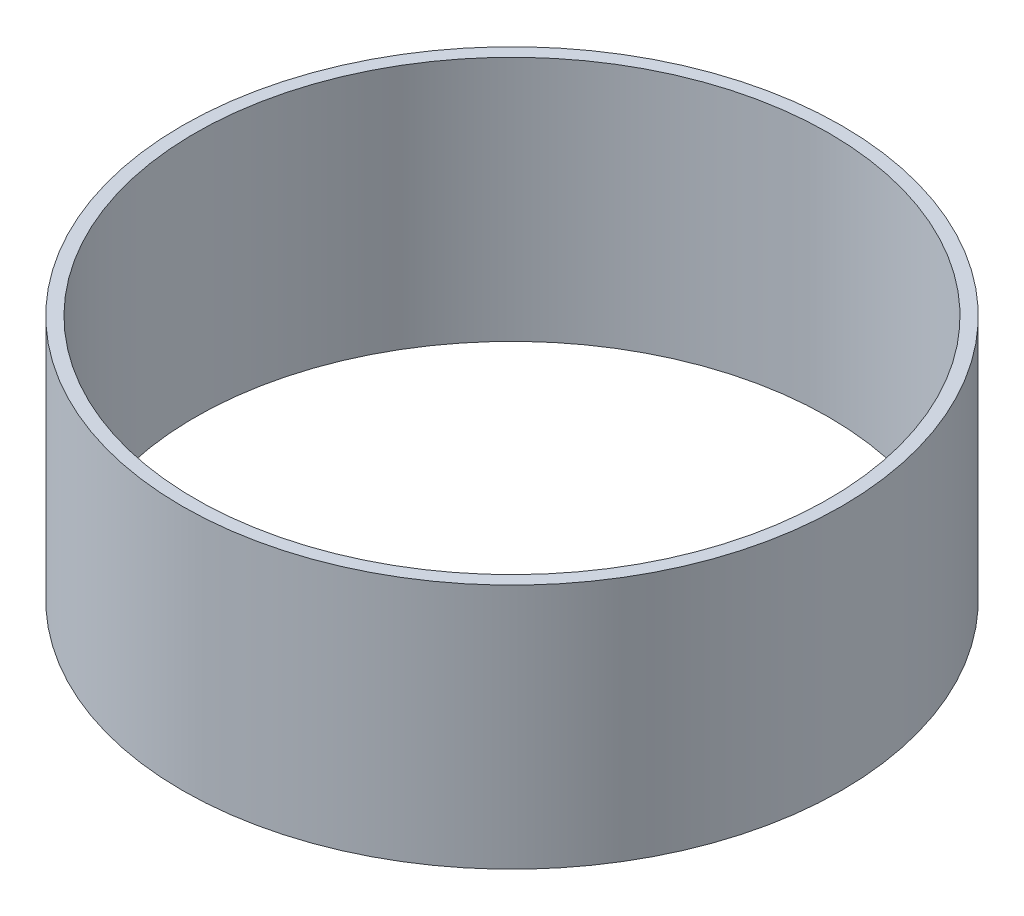
ISO-10303-21;
HEADER;
FILE_DESCRIPTION(('STEP AP214'),'2;1');
FILE_NAME('part.step','',(''),(''),'','','');
FILE_SCHEMA(('AUTOMOTIVE_DESIGN { 1 0 10303 214 1 1 1 1 }'));
ENDSEC;
DATA;
#1=APPLICATION_CONTEXT('core data for automotive mechanical design processes');
#2=APPLICATION_PROTOCOL_DEFINITION('international standard','automotive_design',2000,#1);
#3=PRODUCT_CONTEXT('',#1,'mechanical');
#4=PRODUCT('Part','Part','',(#3));
#5=PRODUCT_RELATED_PRODUCT_CATEGORY('part','',(#4));
#6=PRODUCT_DEFINITION_FORMATION('','',#4);
#7=PRODUCT_DEFINITION_CONTEXT('part definition',#1,'design');
#8=PRODUCT_DEFINITION('design','',#6,#7);
#9=PRODUCT_DEFINITION_SHAPE('','',#8);
#10=(LENGTH_UNIT() NAMED_UNIT(*) SI_UNIT(.MILLI.,.METRE.));
#11=(NAMED_UNIT(*) PLANE_ANGLE_UNIT() SI_UNIT($,.RADIAN.));
#12=(NAMED_UNIT(*) SI_UNIT($,.STERADIAN.) SOLID_ANGLE_UNIT());
#13=UNCERTAINTY_MEASURE_WITH_UNIT(LENGTH_MEASURE(1.E-05),#10,'distance_accuracy_value','');
#14=(GEOMETRIC_REPRESENTATION_CONTEXT(3) GLOBAL_UNCERTAINTY_ASSIGNED_CONTEXT((#13)) GLOBAL_UNIT_ASSIGNED_CONTEXT((#10,
#11,#12)) REPRESENTATION_CONTEXT('',''));
#15=CARTESIAN_POINT('',(0.,0.,0.));
#16=DIRECTION('',(0.,0.,1.));
#17=DIRECTION('',(1.,0.,0.));
#18=AXIS2_PLACEMENT_3D('',#15,#16,#17);
#19=CARTESIAN_POINT('',(0.,38.1,0.));
#20=DIRECTION('',(0.,1.,0.));
#21=DIRECTION('',(0.,0.,1.));
#22=AXIS2_PLACEMENT_3D('',#19,#20,#21);
#23=PLANE('',#22);
#24=CARTESIAN_POINT('',(0.,38.1,0.));
#25=DIRECTION('',(0.,1.,0.));
#26=DIRECTION('',(0.,0.,1.));
#27=AXIS2_PLACEMENT_3D('',#24,#25,#26);
#28=CIRCLE('',#27,51.054);
#29=CARTESIAN_POINT('',(0.,38.1,-51.054));
#30=VERTEX_POINT('',#29);
#31=EDGE_CURVE('E10',#30,#30,#28,.T.);
#32=ORIENTED_EDGE('',*,*,#31,.T.);
#33=EDGE_LOOP('',(#32));
#34=FACE_BOUND('',#33,.T.);
#35=CARTESIAN_POINT('',(0.,38.1,0.));
#36=DIRECTION('',(0.,1.,0.));
#37=DIRECTION('',(0.,0.,1.));
#38=AXIS2_PLACEMENT_3D('',#35,#36,#37);
#39=CIRCLE('',#38,49.0601);
#40=CARTESIAN_POINT('',(0.,38.1,-49.0601));
#41=VERTEX_POINT('',#40);
#42=EDGE_CURVE('E56',#41,#41,#39,.T.);
#43=ORIENTED_EDGE('',*,*,#42,.F.);
#44=EDGE_LOOP('',(#43));
#45=FACE_BOUND('',#44,.T.);
#46=ADVANCED_FACE('F43',(#34,#45),#23,.T.);
#47=CARTESIAN_POINT('',(0.,0.,0.));
#48=DIRECTION('',(0.,1.,0.));
#49=DIRECTION('',(0.,0.,1.));
#50=AXIS2_PLACEMENT_3D('',#47,#48,#49);
#51=PLANE('',#50);
#52=CARTESIAN_POINT('',(0.,0.,0.));
#53=DIRECTION('',(0.,1.,0.));
#54=DIRECTION('',(0.,0.,1.));
#55=AXIS2_PLACEMENT_3D('',#52,#53,#54);
#56=CIRCLE('',#55,51.054);
#57=CARTESIAN_POINT('',(0.,0.,-51.054));
#58=VERTEX_POINT('',#57);
#59=EDGE_CURVE('E47',#58,#58,#56,.T.);
#60=ORIENTED_EDGE('',*,*,#59,.F.);
#61=EDGE_LOOP('',(#60));
#62=FACE_BOUND('',#61,.T.);
#63=CARTESIAN_POINT('',(0.,0.,0.));
#64=DIRECTION('',(0.,1.,0.));
#65=DIRECTION('',(0.,0.,1.));
#66=AXIS2_PLACEMENT_3D('',#63,#64,#65);
#67=CIRCLE('',#66,49.0601);
#68=CARTESIAN_POINT('',(0.,0.,-49.0601));
#69=VERTEX_POINT('',#68);
#70=EDGE_CURVE('E58',#69,#69,#67,.T.);
#71=ORIENTED_EDGE('',*,*,#70,.T.);
#72=EDGE_LOOP('',(#71));
#73=FACE_BOUND('',#72,.T.);
#74=ADVANCED_FACE('F70',(#62,#73),#51,.F.);
#75=CARTESIAN_POINT('',(0.,38.1,0.));
#76=DIRECTION('',(0.,-1.,0.));
#77=DIRECTION('',(0.,0.,-1.));
#78=AXIS2_PLACEMENT_3D('',#75,#76,#77);
#79=CYLINDRICAL_SURFACE('',#78,51.054);
#80=CARTESIAN_POINT('',(0.,38.1,-51.054));
#81=CARTESIAN_POINT('',(0.,37.703125,-51.054));
#82=CARTESIAN_POINT('',(0.,37.30625,-51.054));
#83=CARTESIAN_POINT('',(0.,36.5125,-51.054));
#84=CARTESIAN_POINT('',(0.,36.115625,-51.054));
#85=CARTESIAN_POINT('',(0.,35.321875,-51.054));
#86=CARTESIAN_POINT('',(0.,34.925,-51.054));
#87=CARTESIAN_POINT('',(0.,34.13125,-51.054));
#88=CARTESIAN_POINT('',(0.,33.734375,-51.054));
#89=CARTESIAN_POINT('',(0.,32.940625,-51.054));
#90=CARTESIAN_POINT('',(0.,32.54375,-51.054));
#91=CARTESIAN_POINT('',(0.,31.75,-51.054));
#92=CARTESIAN_POINT('',(0.,31.353125,-51.054));
#93=CARTESIAN_POINT('',(0.,30.559375,-51.054));
#94=CARTESIAN_POINT('',(0.,30.1625,-51.054));
#95=CARTESIAN_POINT('',(0.,29.36875,-51.054));
#96=CARTESIAN_POINT('',(0.,28.971875,-51.054));
#97=CARTESIAN_POINT('',(0.,28.178125,-51.054));
#98=CARTESIAN_POINT('',(0.,27.78125,-51.054));
#99=CARTESIAN_POINT('',(0.,26.9875,-51.054));
#100=CARTESIAN_POINT('',(0.,26.590625,-51.054));
#101=CARTESIAN_POINT('',(0.,25.796875,-51.054));
#102=CARTESIAN_POINT('',(0.,25.4,-51.054));
#103=CARTESIAN_POINT('',(0.,24.60625,-51.054));
#104=CARTESIAN_POINT('',(0.,24.209375,-51.054));
#105=CARTESIAN_POINT('',(0.,23.415625,-51.054));
#106=CARTESIAN_POINT('',(0.,23.01875,-51.054));
#107=CARTESIAN_POINT('',(0.,22.225,-51.054));
#108=CARTESIAN_POINT('',(0.,21.828125,-51.054));
#109=CARTESIAN_POINT('',(0.,21.034375,-51.054));
#110=CARTESIAN_POINT('',(0.,20.6375,-51.054));
#111=CARTESIAN_POINT('',(0.,19.84375,-51.054));
#112=CARTESIAN_POINT('',(0.,19.446875,-51.054));
#113=CARTESIAN_POINT('',(0.,18.653125,-51.054));
#114=CARTESIAN_POINT('',(0.,18.25625,-51.054));
#115=CARTESIAN_POINT('',(0.,17.4625,-51.054));
#116=CARTESIAN_POINT('',(0.,17.065625,-51.054));
#117=CARTESIAN_POINT('',(0.,16.271875,-51.054));
#118=CARTESIAN_POINT('',(0.,15.875,-51.054));
#119=CARTESIAN_POINT('',(0.,15.08125,-51.054));
#120=CARTESIAN_POINT('',(0.,14.684375,-51.054));
#121=CARTESIAN_POINT('',(0.,13.890625,-51.054));
#122=CARTESIAN_POINT('',(0.,13.49375,-51.054));
#123=CARTESIAN_POINT('',(0.,12.7,-51.054));
#124=CARTESIAN_POINT('',(0.,12.303125,-51.054));
#125=CARTESIAN_POINT('',(0.,11.509375,-51.054));
#126=CARTESIAN_POINT('',(0.,11.1125,-51.054));
#127=CARTESIAN_POINT('',(0.,10.31875,-51.054));
#128=CARTESIAN_POINT('',(0.,9.92187499999999,-51.054));
#129=CARTESIAN_POINT('',(0.,9.128125,-51.054));
#130=CARTESIAN_POINT('',(0.,8.73124999999999,-51.054));
#131=CARTESIAN_POINT('',(0.,7.93749999999999,-51.054));
#132=CARTESIAN_POINT('',(0.,7.54062499999999,-51.054));
#133=CARTESIAN_POINT('',(0.,6.746875,-51.054));
#134=CARTESIAN_POINT('',(0.,6.35,-51.054));
#135=CARTESIAN_POINT('',(0.,5.55625,-51.054));
#136=CARTESIAN_POINT('',(0.,5.159375,-51.054));
#137=CARTESIAN_POINT('',(0.,4.365625,-51.054));
#138=CARTESIAN_POINT('',(0.,3.96875,-51.054));
#139=CARTESIAN_POINT('',(0.,3.175,-51.054));
#140=CARTESIAN_POINT('',(0.,2.778125,-51.054));
#141=CARTESIAN_POINT('',(0.,1.984375,-51.054));
#142=CARTESIAN_POINT('',(0.,1.5875,-51.054));
#143=CARTESIAN_POINT('',(0.,0.79375,-51.054));
#144=CARTESIAN_POINT('',(0.,0.396875,-51.054));
#145=CARTESIAN_POINT('',(0.,0.,-51.054));
#146=B_SPLINE_CURVE_WITH_KNOTS('',3,(#80,#81,#82,#83,#84,#85,#86,#87,#88,#89,#90,#91,#92,#93,
#94,#95,#96,#97,#98,#99,#100,#101,#102,#103,#104,#105,#106,#107,#108,#109,#110,#111,#112,#113,
#114,#115,#116,#117,#118,#119,#120,#121,#122,#123,#124,#125,#126,#127,#128,#129,#130,#131,#132,
#133,#134,#135,#136,#137,#138,#139,#140,#141,#142,#143,#144,#145),.UNSPECIFIED.,.F.,.F.,(4,2,2,
2,2,2,2,2,2,2,2,2,2,2,2,2,2,2,2,2,2,2,2,2,2,2,2,2,2,2,2,2,4),(0.,1.190625,2.38125,3.571875,
4.7625,5.953125,7.14375,8.334375,9.52500000000001,10.715625,11.90625,13.096875,14.2875,
15.478125,16.66875,17.859375,19.05,20.240625,21.43125,22.621875,23.8125,25.003125,26.19375,
27.384375,28.575,29.765625,30.95625,32.146875,33.3375,34.528125,35.71875,36.909375,38.1),.UNSPECIFIED.);
#147=EDGE_CURVE('BSEAM45',#30,#58,#146,.T.);
#148=ORIENTED_EDGE('',*,*,#31,.F.);
#149=ORIENTED_EDGE('',*,*,#59,.T.);
#150=ORIENTED_EDGE('',*,*,#147,.T.);
#151=ORIENTED_EDGE('',*,*,#147,.F.);
#152=EDGE_LOOP('',(#148,#150,#149,#151));
#153=FACE_BOUND('',#152,.T.);
#154=ADVANCED_FACE('F45',(#153),#79,.T.);
#155=CARTESIAN_POINT('',(0.,38.1,0.));
#156=DIRECTION('',(0.,-1.,0.));
#157=DIRECTION('',(0.,0.,-1.));
#158=AXIS2_PLACEMENT_3D('',#155,#156,#157);
#159=CYLINDRICAL_SURFACE('',#158,49.0601);
#160=CARTESIAN_POINT('',(0.,38.1,-49.0601));
#161=CARTESIAN_POINT('',(0.,37.703125,-49.0601));
#162=CARTESIAN_POINT('',(0.,37.30625,-49.0601));
#163=CARTESIAN_POINT('',(0.,36.5125,-49.0601));
#164=CARTESIAN_POINT('',(0.,36.115625,-49.0601));
#165=CARTESIAN_POINT('',(0.,35.321875,-49.0601));
#166=CARTESIAN_POINT('',(0.,34.925,-49.0601));
#167=CARTESIAN_POINT('',(0.,34.13125,-49.0601));
#168=CARTESIAN_POINT('',(0.,33.734375,-49.0601));
#169=CARTESIAN_POINT('',(0.,32.940625,-49.0601));
#170=CARTESIAN_POINT('',(0.,32.54375,-49.0601));
#171=CARTESIAN_POINT('',(0.,31.75,-49.0601));
#172=CARTESIAN_POINT('',(0.,31.353125,-49.0601));
#173=CARTESIAN_POINT('',(0.,30.559375,-49.0601));
#174=CARTESIAN_POINT('',(0.,30.1625,-49.0601));
#175=CARTESIAN_POINT('',(0.,29.36875,-49.0601));
#176=CARTESIAN_POINT('',(0.,28.971875,-49.0601));
#177=CARTESIAN_POINT('',(0.,28.178125,-49.0601));
#178=CARTESIAN_POINT('',(0.,27.78125,-49.0601));
#179=CARTESIAN_POINT('',(0.,26.9875,-49.0601));
#180=CARTESIAN_POINT('',(0.,26.590625,-49.0601));
#181=CARTESIAN_POINT('',(0.,25.796875,-49.0601));
#182=CARTESIAN_POINT('',(0.,25.4,-49.0601));
#183=CARTESIAN_POINT('',(0.,24.60625,-49.0601));
#184=CARTESIAN_POINT('',(0.,24.209375,-49.0601));
#185=CARTESIAN_POINT('',(0.,23.415625,-49.0601));
#186=CARTESIAN_POINT('',(0.,23.01875,-49.0601));
#187=CARTESIAN_POINT('',(0.,22.225,-49.0601));
#188=CARTESIAN_POINT('',(0.,21.828125,-49.0601));
#189=CARTESIAN_POINT('',(0.,21.034375,-49.0601));
#190=CARTESIAN_POINT('',(0.,20.6375,-49.0601));
#191=CARTESIAN_POINT('',(0.,19.84375,-49.0601));
#192=CARTESIAN_POINT('',(0.,19.446875,-49.0601));
#193=CARTESIAN_POINT('',(0.,18.653125,-49.0601));
#194=CARTESIAN_POINT('',(0.,18.25625,-49.0601));
#195=CARTESIAN_POINT('',(0.,17.4625,-49.0601));
#196=CARTESIAN_POINT('',(0.,17.065625,-49.0601));
#197=CARTESIAN_POINT('',(0.,16.271875,-49.0601));
#198=CARTESIAN_POINT('',(0.,15.875,-49.0601));
#199=CARTESIAN_POINT('',(0.,15.08125,-49.0601));
#200=CARTESIAN_POINT('',(0.,14.684375,-49.0601));
#201=CARTESIAN_POINT('',(0.,13.890625,-49.0601));
#202=CARTESIAN_POINT('',(0.,13.49375,-49.0601));
#203=CARTESIAN_POINT('',(0.,12.7,-49.0601));
#204=CARTESIAN_POINT('',(0.,12.303125,-49.0601));
#205=CARTESIAN_POINT('',(0.,11.509375,-49.0601));
#206=CARTESIAN_POINT('',(0.,11.1125,-49.0601));
#207=CARTESIAN_POINT('',(0.,10.31875,-49.0601));
#208=CARTESIAN_POINT('',(0.,9.921875,-49.0601));
#209=CARTESIAN_POINT('',(0.,9.128125,-49.0601));
#210=CARTESIAN_POINT('',(0.,8.73125,-49.0601));
#211=CARTESIAN_POINT('',(0.,7.9375,-49.0601));
#212=CARTESIAN_POINT('',(0.,7.540625,-49.0601));
#213=CARTESIAN_POINT('',(0.,6.746875,-49.0601));
#214=CARTESIAN_POINT('',(0.,6.35,-49.0601));
#215=CARTESIAN_POINT('',(0.,5.55625,-49.0601));
#216=CARTESIAN_POINT('',(0.,5.159375,-49.0601));
#217=CARTESIAN_POINT('',(0.,4.365625,-49.0601));
#218=CARTESIAN_POINT('',(0.,3.96875,-49.0601));
#219=CARTESIAN_POINT('',(0.,3.175,-49.0601));
#220=CARTESIAN_POINT('',(0.,2.778125,-49.0601));
#221=CARTESIAN_POINT('',(0.,1.984375,-49.0601));
#222=CARTESIAN_POINT('',(0.,1.5875,-49.0601));
#223=CARTESIAN_POINT('',(0.,0.79375,-49.0601));
#224=CARTESIAN_POINT('',(0.,0.396875,-49.0601));
#225=CARTESIAN_POINT('',(0.,0.,-49.0601));
#226=B_SPLINE_CURVE_WITH_KNOTS('',3,(#160,#161,#162,#163,#164,#165,#166,#167,#168,#169,#170,
#171,#172,#173,#174,#175,#176,#177,#178,#179,#180,#181,#182,#183,#184,#185,#186,#187,#188,#189,
#190,#191,#192,#193,#194,#195,#196,#197,#198,#199,#200,#201,#202,#203,#204,#205,#206,#207,#208,
#209,#210,#211,#212,#213,#214,#215,#216,#217,#218,#219,#220,#221,#222,#223,#224,#225),
.UNSPECIFIED.,.F.,.F.,(4,2,2,2,2,2,2,2,2,2,2,2,2,2,2,2,2,2,2,2,2,2,2,2,2,2,2,2,2,2,2,2,4),(0.,
1.19062499999999,2.38124999999999,3.571875,4.7625,5.953125,7.14375,8.33437499999999,9.525,
10.715625,11.90625,13.096875,14.2875,15.478125,16.66875,17.859375,19.05,20.240625,21.43125,
22.621875,23.8125,25.003125,26.19375,27.384375,28.575,29.765625,30.95625,32.146875,33.3375,
34.528125,35.71875,36.909375,38.1),.UNSPECIFIED.);
#227=EDGE_CURVE('BSEAM66',#41,#69,#226,.T.);
#228=ORIENTED_EDGE('',*,*,#42,.T.);
#229=ORIENTED_EDGE('',*,*,#70,.F.);
#230=ORIENTED_EDGE('',*,*,#227,.T.);
#231=ORIENTED_EDGE('',*,*,#227,.F.);
#232=EDGE_LOOP('',(#228,#230,#229,#231));
#233=FACE_BOUND('',#232,.T.);
#234=ADVANCED_FACE('F66',(#233),#159,.F.);
#235=CLOSED_SHELL('',(#46,#74,#154,#234));
#236=MANIFOLD_SOLID_BREP('B2',#235);
#237=ADVANCED_BREP_SHAPE_REPRESENTATION('',(#18,#236),#14);
#238=SHAPE_DEFINITION_REPRESENTATION(#9,#237);
ENDSEC;
END-ISO-10303-21;
